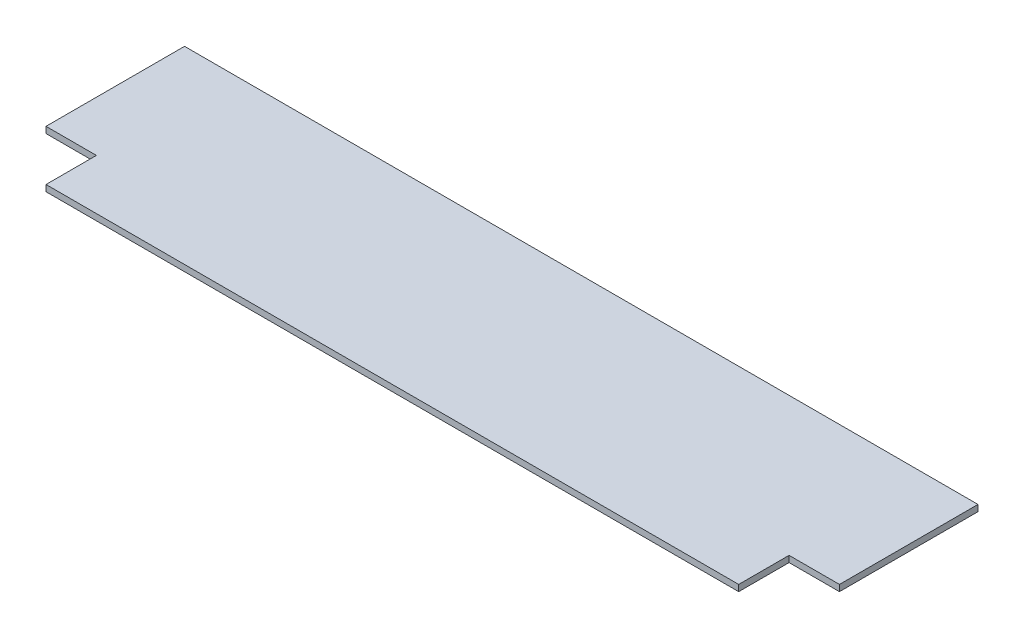
ISO-10303-21;
HEADER;
FILE_DESCRIPTION(('STEP AP214'),'2;1');
FILE_NAME('part.step','',(''),(''),'','','');
FILE_SCHEMA(('AUTOMOTIVE_DESIGN { 1 0 10303 214 1 1 1 1 }'));
ENDSEC;
DATA;
#1=APPLICATION_CONTEXT('core data for automotive mechanical design processes');
#2=APPLICATION_PROTOCOL_DEFINITION('international standard','automotive_design',2000,#1);
#3=PRODUCT_CONTEXT('',#1,'mechanical');
#4=PRODUCT('Part','Part','',(#3));
#5=PRODUCT_RELATED_PRODUCT_CATEGORY('part','',(#4));
#6=PRODUCT_DEFINITION_FORMATION('','',#4);
#7=PRODUCT_DEFINITION_CONTEXT('part definition',#1,'design');
#8=PRODUCT_DEFINITION('design','',#6,#7);
#9=PRODUCT_DEFINITION_SHAPE('','',#8);
#10=(LENGTH_UNIT() NAMED_UNIT(*) SI_UNIT(.MILLI.,.METRE.));
#11=(NAMED_UNIT(*) PLANE_ANGLE_UNIT() SI_UNIT($,.RADIAN.));
#12=(NAMED_UNIT(*) SI_UNIT($,.STERADIAN.) SOLID_ANGLE_UNIT());
#13=UNCERTAINTY_MEASURE_WITH_UNIT(LENGTH_MEASURE(1.E-05),#10,'distance_accuracy_value','');
#14=(GEOMETRIC_REPRESENTATION_CONTEXT(3) GLOBAL_UNCERTAINTY_ASSIGNED_CONTEXT((#13)) GLOBAL_UNIT_ASSIGNED_CONTEXT((#10,
#11,#12)) REPRESENTATION_CONTEXT('',''));
#15=CARTESIAN_POINT('',(0.,0.,0.));
#16=DIRECTION('',(0.,0.,1.));
#17=DIRECTION('',(1.,0.,0.));
#18=AXIS2_PLACEMENT_3D('',#15,#16,#17);
#19=CARTESIAN_POINT('',(400.05,6.35,95.25));
#20=DIRECTION('',(-1.,0.,0.));
#21=DIRECTION('',(0.,0.,1.));
#22=AXIS2_PLACEMENT_3D('',#19,#20,#21);
#23=PLANE('',#22);
#24=DIRECTION('',(0.,0.,-1.));
#25=VECTOR('',#24,1.);
#26=CARTESIAN_POINT('',(400.05,6.35,95.25));
#27=LINE('',#26,#25);
#28=CARTESIAN_POINT('',(400.05,6.35,44.45));
#29=VERTEX_POINT('',#28);
#30=CARTESIAN_POINT('',(400.05,6.35,-95.25));
#31=VERTEX_POINT('',#30);
#32=EDGE_CURVE('E116',#29,#31,#27,.T.);
#33=ORIENTED_EDGE('',*,*,#32,.F.);
#34=DIRECTION('',(0.,1.,0.));
#35=VECTOR('',#34,1.);
#36=CARTESIAN_POINT('',(400.05,0.,44.45));
#37=LINE('',#36,#35);
#38=CARTESIAN_POINT('',(400.05,0.,44.45));
#39=VERTEX_POINT('',#38);
#40=EDGE_CURVE('E157',#39,#29,#37,.T.);
#41=ORIENTED_EDGE('',*,*,#40,.F.);
#42=DIRECTION('',(0.,0.,-1.));
#43=VECTOR('',#42,1.);
#44=CARTESIAN_POINT('',(400.05,0.,95.25));
#45=LINE('',#44,#43);
#46=CARTESIAN_POINT('',(400.05,0.,-95.25));
#47=VERTEX_POINT('',#46);
#48=EDGE_CURVE('E139',#39,#47,#45,.T.);
#49=ORIENTED_EDGE('',*,*,#48,.T.);
#50=DIRECTION('',(0.,-1.,0.));
#51=VECTOR('',#50,1.);
#52=CARTESIAN_POINT('',(400.05,6.35,-95.25));
#53=LINE('',#52,#51);
#54=EDGE_CURVE('E11',#31,#47,#53,.T.);
#55=ORIENTED_EDGE('',*,*,#54,.F.);
#56=EDGE_LOOP('',(#33,#41,#49,#55));
#57=FACE_BOUND('',#56,.T.);
#58=ADVANCED_FACE('F32',(#57),#23,.F.);
#59=CARTESIAN_POINT('',(-400.05,6.35,-95.25));
#60=DIRECTION('',(0.,0.,1.));
#61=DIRECTION('',(1.,0.,0.));
#62=AXIS2_PLACEMENT_3D('',#59,#60,#61);
#63=PLANE('',#62);
#64=DIRECTION('',(-1.,0.,0.));
#65=VECTOR('',#64,1.);
#66=CARTESIAN_POINT('',(-400.05,0.,-95.25));
#67=LINE('',#66,#65);
#68=CARTESIAN_POINT('',(-400.05,0.,-95.25));
#69=VERTEX_POINT('',#68);
#70=EDGE_CURVE('E122',#47,#69,#67,.T.);
#71=ORIENTED_EDGE('',*,*,#70,.T.);
#72=DIRECTION('',(0.,-1.,0.));
#73=VECTOR('',#72,1.);
#74=CARTESIAN_POINT('',(-400.05,6.35,-95.25));
#75=LINE('',#74,#73);
#76=CARTESIAN_POINT('',(-400.05,6.35,-95.25));
#77=VERTEX_POINT('',#76);
#78=EDGE_CURVE('E39',#77,#69,#75,.T.);
#79=ORIENTED_EDGE('',*,*,#78,.F.);
#80=DIRECTION('',(-1.,0.,0.));
#81=VECTOR('',#80,1.);
#82=CARTESIAN_POINT('',(-400.05,6.35,-95.25));
#83=LINE('',#82,#81);
#84=EDGE_CURVE('E119',#31,#77,#83,.T.);
#85=ORIENTED_EDGE('',*,*,#84,.F.);
#86=ORIENTED_EDGE('',*,*,#54,.T.);
#87=EDGE_LOOP('',(#71,#79,#85,#86));
#88=FACE_BOUND('',#87,.T.);
#89=ADVANCED_FACE('F143',(#88),#63,.F.);
#90=CARTESIAN_POINT('',(-400.05,6.35,95.25));
#91=DIRECTION('',(1.,0.,0.));
#92=DIRECTION('',(0.,0.,-1.));
#93=AXIS2_PLACEMENT_3D('',#90,#91,#92);
#94=PLANE('',#93);
#95=DIRECTION('',(0.,0.,1.));
#96=VECTOR('',#95,1.);
#97=CARTESIAN_POINT('',(-400.05,0.,95.25));
#98=LINE('',#97,#96);
#99=CARTESIAN_POINT('',(-400.05,0.,44.45));
#100=VERTEX_POINT('',#99);
#101=EDGE_CURVE('E117',#69,#100,#98,.T.);
#102=ORIENTED_EDGE('',*,*,#101,.T.);
#103=DIRECTION('',(0.,1.,0.));
#104=VECTOR('',#103,1.);
#105=CARTESIAN_POINT('',(-400.05,0.,44.45));
#106=LINE('',#105,#104);
#107=CARTESIAN_POINT('',(-400.05,6.35,44.45));
#108=VERTEX_POINT('',#107);
#109=EDGE_CURVE('E149',#100,#108,#106,.T.);
#110=ORIENTED_EDGE('',*,*,#109,.T.);
#111=DIRECTION('',(0.,0.,1.));
#112=VECTOR('',#111,1.);
#113=CARTESIAN_POINT('',(-400.05,6.35,95.25));
#114=LINE('',#113,#112);
#115=EDGE_CURVE('E130',#77,#108,#114,.T.);
#116=ORIENTED_EDGE('',*,*,#115,.F.);
#117=ORIENTED_EDGE('',*,*,#78,.T.);
#118=EDGE_LOOP('',(#102,#110,#116,#117));
#119=FACE_BOUND('',#118,.T.);
#120=ADVANCED_FACE('F148',(#119),#94,.F.);
#121=CARTESIAN_POINT('',(-400.05,6.35,95.25));
#122=DIRECTION('',(0.,0.,-1.));
#123=DIRECTION('',(-1.,0.,0.));
#124=AXIS2_PLACEMENT_3D('',#121,#122,#123);
#125=PLANE('',#124);
#126=DIRECTION('',(1.,0.,0.));
#127=VECTOR('',#126,1.);
#128=CARTESIAN_POINT('',(-400.05,6.35,95.25));
#129=LINE('',#128,#127);
#130=CARTESIAN_POINT('',(-349.25,6.35,95.25));
#131=VERTEX_POINT('',#130);
#132=CARTESIAN_POINT('',(349.25,6.35,95.25));
#133=VERTEX_POINT('',#132);
#134=EDGE_CURVE('E112',#131,#133,#129,.T.);
#135=ORIENTED_EDGE('',*,*,#134,.F.);
#136=DIRECTION('',(0.,1.,0.));
#137=VECTOR('',#136,1.);
#138=CARTESIAN_POINT('',(-349.25,0.,95.25));
#139=LINE('',#138,#137);
#140=CARTESIAN_POINT('',(-349.25,0.,95.25));
#141=VERTEX_POINT('',#140);
#142=EDGE_CURVE('E100',#141,#131,#139,.T.);
#143=ORIENTED_EDGE('',*,*,#142,.F.);
#144=DIRECTION('',(1.,0.,0.));
#145=VECTOR('',#144,1.);
#146=CARTESIAN_POINT('',(-400.05,0.,95.25));
#147=LINE('',#146,#145);
#148=CARTESIAN_POINT('',(349.25,0.,95.25));
#149=VERTEX_POINT('',#148);
#150=EDGE_CURVE('E111',#141,#149,#147,.T.);
#151=ORIENTED_EDGE('',*,*,#150,.T.);
#152=DIRECTION('',(0.,1.,0.));
#153=VECTOR('',#152,1.);
#154=CARTESIAN_POINT('',(349.25,0.,95.25));
#155=LINE('',#154,#153);
#156=EDGE_CURVE('E140',#149,#133,#155,.T.);
#157=ORIENTED_EDGE('',*,*,#156,.T.);
#158=EDGE_LOOP('',(#135,#143,#151,#157));
#159=FACE_BOUND('',#158,.T.);
#160=ADVANCED_FACE('F109',(#159),#125,.F.);
#161=CARTESIAN_POINT('',(0.,6.35,0.));
#162=DIRECTION('',(0.,-1.,0.));
#163=DIRECTION('',(0.,0.,-1.));
#164=AXIS2_PLACEMENT_3D('',#161,#162,#163);
#165=PLANE('',#164);
#166=ORIENTED_EDGE('',*,*,#115,.T.);
#167=DIRECTION('',(-1.,0.,0.));
#168=VECTOR('',#167,1.);
#169=CARTESIAN_POINT('',(-400.05,6.35,44.45));
#170=LINE('',#169,#168);
#171=CARTESIAN_POINT('',(-349.25,6.35,44.45));
#172=VERTEX_POINT('',#171);
#173=EDGE_CURVE('E105',#172,#108,#170,.T.);
#174=ORIENTED_EDGE('',*,*,#173,.F.);
#175=DIRECTION('',(0.,0.,-1.));
#176=VECTOR('',#175,1.);
#177=CARTESIAN_POINT('',(-349.25,6.35,95.25));
#178=LINE('',#177,#176);
#179=EDGE_CURVE('E171',#131,#172,#178,.T.);
#180=ORIENTED_EDGE('',*,*,#179,.F.);
#181=ORIENTED_EDGE('',*,*,#134,.T.);
#182=DIRECTION('',(0.,0.,1.));
#183=VECTOR('',#182,1.);
#184=CARTESIAN_POINT('',(349.25,6.35,95.25));
#185=LINE('',#184,#183);
#186=CARTESIAN_POINT('',(349.25,6.35,44.45));
#187=VERTEX_POINT('',#186);
#188=EDGE_CURVE('E162',#187,#133,#185,.T.);
#189=ORIENTED_EDGE('',*,*,#188,.F.);
#190=DIRECTION('',(-1.,0.,0.));
#191=VECTOR('',#190,1.);
#192=CARTESIAN_POINT('',(400.05,6.35,44.45));
#193=LINE('',#192,#191);
#194=EDGE_CURVE('E150',#29,#187,#193,.T.);
#195=ORIENTED_EDGE('',*,*,#194,.F.);
#196=ORIENTED_EDGE('',*,*,#32,.T.);
#197=ORIENTED_EDGE('',*,*,#84,.T.);
#198=EDGE_LOOP('',(#166,#174,#180,#181,#189,#195,#196,#197));
#199=FACE_BOUND('',#198,.T.);
#200=ADVANCED_FACE('F153',(#199),#165,.F.);
#201=CARTESIAN_POINT('',(0.,0.,0.));
#202=DIRECTION('',(0.,-1.,0.));
#203=DIRECTION('',(0.,0.,-1.));
#204=AXIS2_PLACEMENT_3D('',#201,#202,#203);
#205=PLANE('',#204);
#206=DIRECTION('',(-1.,0.,0.));
#207=VECTOR('',#206,1.);
#208=CARTESIAN_POINT('',(-400.05,0.,44.45));
#209=LINE('',#208,#207);
#210=CARTESIAN_POINT('',(-349.25,0.,44.45));
#211=VERTEX_POINT('',#210);
#212=EDGE_CURVE('E46',#211,#100,#209,.T.);
#213=ORIENTED_EDGE('',*,*,#212,.T.);
#214=ORIENTED_EDGE('',*,*,#101,.F.);
#215=ORIENTED_EDGE('',*,*,#70,.F.);
#216=ORIENTED_EDGE('',*,*,#48,.F.);
#217=DIRECTION('',(-1.,0.,0.));
#218=VECTOR('',#217,1.);
#219=CARTESIAN_POINT('',(400.05,0.,44.45));
#220=LINE('',#219,#218);
#221=CARTESIAN_POINT('',(349.25,0.,44.45));
#222=VERTEX_POINT('',#221);
#223=EDGE_CURVE('E164',#39,#222,#220,.T.);
#224=ORIENTED_EDGE('',*,*,#223,.T.);
#225=DIRECTION('',(0.,0.,1.));
#226=VECTOR('',#225,1.);
#227=CARTESIAN_POINT('',(349.25,0.,95.25));
#228=LINE('',#227,#226);
#229=EDGE_CURVE('E54',#222,#149,#228,.T.);
#230=ORIENTED_EDGE('',*,*,#229,.T.);
#231=ORIENTED_EDGE('',*,*,#150,.F.);
#232=DIRECTION('',(0.,0.,-1.));
#233=VECTOR('',#232,1.);
#234=CARTESIAN_POINT('',(-349.25,0.,95.25));
#235=LINE('',#234,#233);
#236=EDGE_CURVE('E96',#141,#211,#235,.T.);
#237=ORIENTED_EDGE('',*,*,#236,.T.);
#238=EDGE_LOOP('',(#213,#214,#215,#216,#224,#230,#231,#237));
#239=FACE_BOUND('',#238,.T.);
#240=ADVANCED_FACE('F114',(#239),#205,.T.);
#241=CARTESIAN_POINT('',(349.25,0.,95.25));
#242=DIRECTION('',(-1.,0.,0.));
#243=DIRECTION('',(0.,0.,1.));
#244=AXIS2_PLACEMENT_3D('',#241,#242,#243);
#245=PLANE('',#244);
#246=ORIENTED_EDGE('',*,*,#188,.T.);
#247=ORIENTED_EDGE('',*,*,#156,.F.);
#248=ORIENTED_EDGE('',*,*,#229,.F.);
#249=DIRECTION('',(0.,1.,0.));
#250=VECTOR('',#249,1.);
#251=CARTESIAN_POINT('',(349.25,0.,44.45));
#252=LINE('',#251,#250);
#253=EDGE_CURVE('E159',#222,#187,#252,.T.);
#254=ORIENTED_EDGE('',*,*,#253,.T.);
#255=EDGE_LOOP('',(#246,#247,#248,#254));
#256=FACE_BOUND('',#255,.T.);
#257=ADVANCED_FACE('F182',(#256),#245,.F.);
#258=CARTESIAN_POINT('',(400.05,0.,44.45));
#259=DIRECTION('',(0.,0.,-1.));
#260=DIRECTION('',(-1.,0.,0.));
#261=AXIS2_PLACEMENT_3D('',#258,#259,#260);
#262=PLANE('',#261);
#263=ORIENTED_EDGE('',*,*,#194,.T.);
#264=ORIENTED_EDGE('',*,*,#253,.F.);
#265=ORIENTED_EDGE('',*,*,#223,.F.);
#266=ORIENTED_EDGE('',*,*,#40,.T.);
#267=EDGE_LOOP('',(#263,#264,#265,#266));
#268=FACE_BOUND('',#267,.T.);
#269=ADVANCED_FACE('F175',(#268),#262,.F.);
#270=CARTESIAN_POINT('',(-400.05,0.,44.45));
#271=DIRECTION('',(0.,0.,-1.));
#272=DIRECTION('',(-1.,0.,0.));
#273=AXIS2_PLACEMENT_3D('',#270,#271,#272);
#274=PLANE('',#273);
#275=ORIENTED_EDGE('',*,*,#173,.T.);
#276=ORIENTED_EDGE('',*,*,#109,.F.);
#277=ORIENTED_EDGE('',*,*,#212,.F.);
#278=DIRECTION('',(0.,1.,0.));
#279=VECTOR('',#278,1.);
#280=CARTESIAN_POINT('',(-349.25,0.,44.45));
#281=LINE('',#280,#279);
#282=EDGE_CURVE('E102',#211,#172,#281,.T.);
#283=ORIENTED_EDGE('',*,*,#282,.T.);
#284=EDGE_LOOP('',(#275,#276,#277,#283));
#285=FACE_BOUND('',#284,.T.);
#286=ADVANCED_FACE('F173',(#285),#274,.F.);
#287=CARTESIAN_POINT('',(-349.25,0.,95.25));
#288=DIRECTION('',(1.,0.,0.));
#289=DIRECTION('',(0.,0.,-1.));
#290=AXIS2_PLACEMENT_3D('',#287,#288,#289);
#291=PLANE('',#290);
#292=ORIENTED_EDGE('',*,*,#179,.T.);
#293=ORIENTED_EDGE('',*,*,#282,.F.);
#294=ORIENTED_EDGE('',*,*,#236,.F.);
#295=ORIENTED_EDGE('',*,*,#142,.T.);
#296=EDGE_LOOP('',(#292,#293,#294,#295));
#297=FACE_BOUND('',#296,.T.);
#298=ADVANCED_FACE('F99',(#297),#291,.F.);
#299=CLOSED_SHELL('',(#58,#89,#120,#160,#200,#240,#257,#269,#286,#298));
#300=MANIFOLD_SOLID_BREP('B2',#299);
#301=ADVANCED_BREP_SHAPE_REPRESENTATION('',(#18,#300),#14);
#302=SHAPE_DEFINITION_REPRESENTATION(#9,#301);
ENDSEC;
END-ISO-10303-21;
